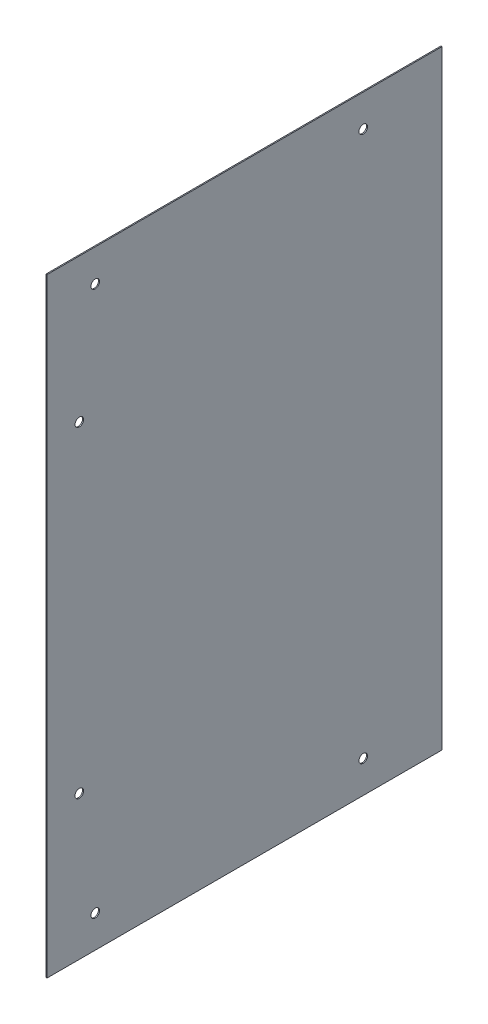
ISO-10303-21;
HEADER;
FILE_DESCRIPTION(('STEP AP214'),'2;1');
FILE_NAME('part.step','',(''),(''),'','','');
FILE_SCHEMA(('AUTOMOTIVE_DESIGN { 1 0 10303 214 1 1 1 1 }'));
ENDSEC;
DATA;
#1=APPLICATION_CONTEXT('core data for automotive mechanical design processes');
#2=APPLICATION_PROTOCOL_DEFINITION('international standard','automotive_design',2000,#1);
#3=PRODUCT_CONTEXT('',#1,'mechanical');
#4=PRODUCT('Part','Part','',(#3));
#5=PRODUCT_RELATED_PRODUCT_CATEGORY('part','',(#4));
#6=PRODUCT_DEFINITION_FORMATION('','',#4);
#7=PRODUCT_DEFINITION_CONTEXT('part definition',#1,'design');
#8=PRODUCT_DEFINITION('design','',#6,#7);
#9=PRODUCT_DEFINITION_SHAPE('','',#8);
#10=(LENGTH_UNIT() NAMED_UNIT(*) SI_UNIT(.MILLI.,.METRE.));
#11=(NAMED_UNIT(*) PLANE_ANGLE_UNIT() SI_UNIT($,.RADIAN.));
#12=(NAMED_UNIT(*) SI_UNIT($,.STERADIAN.) SOLID_ANGLE_UNIT());
#13=UNCERTAINTY_MEASURE_WITH_UNIT(LENGTH_MEASURE(1.E-05),#10,'distance_accuracy_value','');
#14=(GEOMETRIC_REPRESENTATION_CONTEXT(3) GLOBAL_UNCERTAINTY_ASSIGNED_CONTEXT((#13)) GLOBAL_UNIT_ASSIGNED_CONTEXT((#10,
#11,#12)) REPRESENTATION_CONTEXT('',''));
#15=CARTESIAN_POINT('',(0.,0.,0.));
#16=DIRECTION('',(0.,0.,1.));
#17=DIRECTION('',(1.,0.,0.));
#18=AXIS2_PLACEMENT_3D('',#15,#16,#17);
#19=CARTESIAN_POINT('',(0.5,0.,0.));
#20=DIRECTION('',(-1.,0.,0.));
#21=DIRECTION('',(0.,0.,1.));
#22=AXIS2_PLACEMENT_3D('',#19,#20,#21);
#23=PLANE('',#22);
#24=CARTESIAN_POINT('',(0.5,-254.125,139.261087025044));
#25=DIRECTION('',(-1.,0.,0.));
#26=DIRECTION('',(0.,0.,1.));
#27=AXIS2_PLACEMENT_3D('',#24,#25,#26);
#28=CIRCLE('',#27,3.99999999999999);
#29=CARTESIAN_POINT('',(0.5,-254.125,143.261087025044));
#30=VERTEX_POINT('',#29);
#31=EDGE_CURVE('E106',#30,#30,#28,.T.);
#32=ORIENTED_EDGE('',*,*,#31,.T.);
#33=EDGE_LOOP('',(#32));
#34=FACE_BOUND('',#33,.T.);
#35=CARTESIAN_POINT('',(0.5,150.,154.125));
#36=DIRECTION('',(-1.,0.,0.));
#37=DIRECTION('',(0.,0.,1.));
#38=AXIS2_PLACEMENT_3D('',#35,#36,#37);
#39=CIRCLE('',#38,3.99999999999999);
#40=CARTESIAN_POINT('',(0.5,150.,158.125));
#41=VERTEX_POINT('',#40);
#42=EDGE_CURVE('E126',#41,#41,#39,.T.);
#43=ORIENTED_EDGE('',*,*,#42,.T.);
#44=EDGE_LOOP('',(#43));
#45=FACE_BOUND('',#44,.T.);
#46=CARTESIAN_POINT('',(0.5,-254.125,-110.738912974956));
#47=DIRECTION('',(-1.,0.,0.));
#48=DIRECTION('',(0.,0.,1.));
#49=AXIS2_PLACEMENT_3D('',#46,#47,#48);
#50=CIRCLE('',#49,4.00000000000001);
#51=CARTESIAN_POINT('',(0.5,-254.125,-106.738912974956));
#52=VERTEX_POINT('',#51);
#53=EDGE_CURVE('E129',#52,#52,#50,.T.);
#54=ORIENTED_EDGE('',*,*,#53,.T.);
#55=EDGE_LOOP('',(#54));
#56=FACE_BOUND('',#55,.T.);
#57=CARTESIAN_POINT('',(0.5,-150.,154.125));
#58=DIRECTION('',(-1.,0.,0.));
#59=DIRECTION('',(0.,0.,1.));
#60=AXIS2_PLACEMENT_3D('',#57,#58,#59);
#61=CIRCLE('',#60,3.99999999999999);
#62=CARTESIAN_POINT('',(0.5,-150.,158.125));
#63=VERTEX_POINT('',#62);
#64=EDGE_CURVE('E132',#63,#63,#61,.T.);
#65=ORIENTED_EDGE('',*,*,#64,.T.);
#66=EDGE_LOOP('',(#65));
#67=FACE_BOUND('',#66,.T.);
#68=DIRECTION('',(0.,0.,-1.));
#69=VECTOR('',#68,1.);
#70=CARTESIAN_POINT('',(0.5,-284.125,-184.125));
#71=LINE('',#70,#69);
#72=CARTESIAN_POINT('',(0.5,-284.125,184.125));
#73=VERTEX_POINT('',#72);
#74=CARTESIAN_POINT('',(0.5,-284.125,-184.125));
#75=VERTEX_POINT('',#74);
#76=EDGE_CURVE('E91',#73,#75,#71,.T.);
#77=ORIENTED_EDGE('',*,*,#76,.T.);
#78=DIRECTION('',(0.,1.,0.));
#79=VECTOR('',#78,1.);
#80=CARTESIAN_POINT('',(0.5,-284.125,-184.125));
#81=LINE('',#80,#79);
#82=CARTESIAN_POINT('',(0.5,284.125,-184.125));
#83=VERTEX_POINT('',#82);
#84=EDGE_CURVE('E86',#75,#83,#81,.T.);
#85=ORIENTED_EDGE('',*,*,#84,.T.);
#86=DIRECTION('',(0.,0.,1.));
#87=VECTOR('',#86,1.);
#88=CARTESIAN_POINT('',(0.5,284.125,-184.125));
#89=LINE('',#88,#87);
#90=CARTESIAN_POINT('',(0.5,284.125,184.125));
#91=VERTEX_POINT('',#90);
#92=EDGE_CURVE('E89',#83,#91,#89,.T.);
#93=ORIENTED_EDGE('',*,*,#92,.T.);
#94=DIRECTION('',(0.,-1.,0.));
#95=VECTOR('',#94,1.);
#96=CARTESIAN_POINT('',(0.5,-284.125,184.125));
#97=LINE('',#96,#95);
#98=EDGE_CURVE('E56',#91,#73,#97,.T.);
#99=ORIENTED_EDGE('',*,*,#98,.T.);
#100=EDGE_LOOP('',(#77,#85,#93,#99));
#101=FACE_BOUND('',#100,.T.);
#102=CARTESIAN_POINT('',(0.5,254.125,139.261087025044));
#103=DIRECTION('',(-1.,0.,0.));
#104=DIRECTION('',(0.,0.,1.));
#105=AXIS2_PLACEMENT_3D('',#102,#103,#104);
#106=CIRCLE('',#105,3.99999999999999);
#107=CARTESIAN_POINT('',(0.5,254.125,143.261087025044));
#108=VERTEX_POINT('',#107);
#109=EDGE_CURVE('E123',#108,#108,#106,.F.);
#110=ORIENTED_EDGE('',*,*,#109,.F.);
#111=EDGE_LOOP('',(#110));
#112=FACE_BOUND('',#111,.T.);
#113=CARTESIAN_POINT('',(0.5,254.125,-110.738912974956));
#114=DIRECTION('',(-1.,0.,0.));
#115=DIRECTION('',(0.,0.,1.));
#116=AXIS2_PLACEMENT_3D('',#113,#114,#115);
#117=CIRCLE('',#116,4.00000000000001);
#118=CARTESIAN_POINT('',(0.5,254.125,-106.738912974956));
#119=VERTEX_POINT('',#118);
#120=EDGE_CURVE('E120',#119,#119,#117,.F.);
#121=ORIENTED_EDGE('',*,*,#120,.F.);
#122=EDGE_LOOP('',(#121));
#123=FACE_BOUND('',#122,.T.);
#124=ADVANCED_FACE('F39',(#34,#45,#56,#67,#101,#112,#123),#23,.F.);
#125=CARTESIAN_POINT('',(-0.5,0.,0.));
#126=DIRECTION('',(-1.,0.,0.));
#127=DIRECTION('',(0.,0.,1.));
#128=AXIS2_PLACEMENT_3D('',#125,#126,#127);
#129=PLANE('',#128);
#130=CARTESIAN_POINT('',(-0.5,-254.125,139.261087025044));
#131=DIRECTION('',(1.,0.,0.));
#132=DIRECTION('',(0.,0.,-1.));
#133=AXIS2_PLACEMENT_3D('',#130,#131,#132);
#134=CIRCLE('',#133,3.99999999999999);
#135=CARTESIAN_POINT('',(-0.5,-254.125,135.261087025044));
#136=VERTEX_POINT('',#135);
#137=EDGE_CURVE('E145',#136,#136,#134,.T.);
#138=ORIENTED_EDGE('',*,*,#137,.T.);
#139=EDGE_LOOP('',(#138));
#140=FACE_BOUND('',#139,.T.);
#141=CARTESIAN_POINT('',(-0.5,254.125,139.261087025044));
#142=DIRECTION('',(-1.,0.,0.));
#143=DIRECTION('',(0.,0.,1.));
#144=AXIS2_PLACEMENT_3D('',#141,#142,#143);
#145=CIRCLE('',#144,3.99999999999999);
#146=CARTESIAN_POINT('',(-0.5,254.125,143.261087025044));
#147=VERTEX_POINT('',#146);
#148=EDGE_CURVE('E139',#147,#147,#145,.T.);
#149=ORIENTED_EDGE('',*,*,#148,.F.);
#150=EDGE_LOOP('',(#149));
#151=FACE_BOUND('',#150,.T.);
#152=CARTESIAN_POINT('',(-0.5,150.,154.125));
#153=DIRECTION('',(1.,0.,0.));
#154=DIRECTION('',(0.,0.,-1.));
#155=AXIS2_PLACEMENT_3D('',#152,#153,#154);
#156=CIRCLE('',#155,3.99999999999999);
#157=CARTESIAN_POINT('',(-0.5,150.,150.125));
#158=VERTEX_POINT('',#157);
#159=EDGE_CURVE('E138',#158,#158,#156,.T.);
#160=ORIENTED_EDGE('',*,*,#159,.T.);
#161=EDGE_LOOP('',(#160));
#162=FACE_BOUND('',#161,.T.);
#163=CARTESIAN_POINT('',(-0.5,-254.125,-110.738912974956));
#164=DIRECTION('',(1.,0.,0.));
#165=DIRECTION('',(0.,0.,-1.));
#166=AXIS2_PLACEMENT_3D('',#163,#164,#165);
#167=CIRCLE('',#166,4.00000000000001);
#168=CARTESIAN_POINT('',(-0.5,-254.125,-114.738912974956));
#169=VERTEX_POINT('',#168);
#170=EDGE_CURVE('E148',#169,#169,#167,.T.);
#171=ORIENTED_EDGE('',*,*,#170,.T.);
#172=EDGE_LOOP('',(#171));
#173=FACE_BOUND('',#172,.T.);
#174=CARTESIAN_POINT('',(-0.5,-150.,154.125));
#175=DIRECTION('',(1.,0.,0.));
#176=DIRECTION('',(0.,0.,-1.));
#177=AXIS2_PLACEMENT_3D('',#174,#175,#176);
#178=CIRCLE('',#177,3.99999999999999);
#179=CARTESIAN_POINT('',(-0.5,-150.,150.125));
#180=VERTEX_POINT('',#179);
#181=EDGE_CURVE('E135',#180,#180,#178,.T.);
#182=ORIENTED_EDGE('',*,*,#181,.T.);
#183=EDGE_LOOP('',(#182));
#184=FACE_BOUND('',#183,.T.);
#185=DIRECTION('',(0.,0.,-1.));
#186=VECTOR('',#185,1.);
#187=CARTESIAN_POINT('',(-0.5,-284.125,-184.125));
#188=LINE('',#187,#186);
#189=CARTESIAN_POINT('',(-0.5,-284.125,184.125));
#190=VERTEX_POINT('',#189);
#191=CARTESIAN_POINT('',(-0.5,-284.125,-184.125));
#192=VERTEX_POINT('',#191);
#193=EDGE_CURVE('E103',#190,#192,#188,.T.);
#194=ORIENTED_EDGE('',*,*,#193,.F.);
#195=DIRECTION('',(0.,-1.,0.));
#196=VECTOR('',#195,1.);
#197=CARTESIAN_POINT('',(-0.5,-284.125,184.125));
#198=LINE('',#197,#196);
#199=CARTESIAN_POINT('',(-0.5,284.125,184.125));
#200=VERTEX_POINT('',#199);
#201=EDGE_CURVE('E79',#200,#190,#198,.T.);
#202=ORIENTED_EDGE('',*,*,#201,.F.);
#203=DIRECTION('',(0.,0.,1.));
#204=VECTOR('',#203,1.);
#205=CARTESIAN_POINT('',(-0.5,284.125,-184.125));
#206=LINE('',#205,#204);
#207=CARTESIAN_POINT('',(-0.5,284.125,-184.125));
#208=VERTEX_POINT('',#207);
#209=EDGE_CURVE('E73',#208,#200,#206,.T.);
#210=ORIENTED_EDGE('',*,*,#209,.F.);
#211=DIRECTION('',(0.,1.,0.));
#212=VECTOR('',#211,1.);
#213=CARTESIAN_POINT('',(-0.5,-284.125,-184.125));
#214=LINE('',#213,#212);
#215=EDGE_CURVE('E95',#192,#208,#214,.T.);
#216=ORIENTED_EDGE('',*,*,#215,.F.);
#217=EDGE_LOOP('',(#194,#202,#210,#216));
#218=FACE_BOUND('',#217,.T.);
#219=CARTESIAN_POINT('',(-0.5,254.125,-110.738912974956));
#220=DIRECTION('',(-1.,0.,0.));
#221=DIRECTION('',(0.,0.,1.));
#222=AXIS2_PLACEMENT_3D('',#219,#220,#221);
#223=CIRCLE('',#222,4.00000000000001);
#224=CARTESIAN_POINT('',(-0.5,254.125,-106.738912974956));
#225=VERTEX_POINT('',#224);
#226=EDGE_CURVE('E142',#225,#225,#223,.T.);
#227=ORIENTED_EDGE('',*,*,#226,.F.);
#228=EDGE_LOOP('',(#227));
#229=FACE_BOUND('',#228,.T.);
#230=ADVANCED_FACE('F114',(#140,#151,#162,#173,#184,#218,#229),#129,.T.);
#231=CARTESIAN_POINT('',(0.5,-284.125,-184.125));
#232=DIRECTION('',(0.,1.,0.));
#233=DIRECTION('',(0.,0.,1.));
#234=AXIS2_PLACEMENT_3D('',#231,#232,#233);
#235=PLANE('',#234);
#236=ORIENTED_EDGE('',*,*,#193,.T.);
#237=DIRECTION('',(-1.,0.,0.));
#238=VECTOR('',#237,1.);
#239=CARTESIAN_POINT('',(0.5,-284.125,-184.125));
#240=LINE('',#239,#238);
#241=EDGE_CURVE('E11',#75,#192,#240,.T.);
#242=ORIENTED_EDGE('',*,*,#241,.F.);
#243=ORIENTED_EDGE('',*,*,#76,.F.);
#244=DIRECTION('',(-1.,0.,0.));
#245=VECTOR('',#244,1.);
#246=CARTESIAN_POINT('',(0.5,-284.125,184.125));
#247=LINE('',#246,#245);
#248=EDGE_CURVE('E99',#73,#190,#247,.T.);
#249=ORIENTED_EDGE('',*,*,#248,.T.);
#250=EDGE_LOOP('',(#236,#242,#243,#249));
#251=FACE_BOUND('',#250,.T.);
#252=ADVANCED_FACE('F41',(#251),#235,.F.);
#253=CARTESIAN_POINT('',(0.5,-284.125,-184.125));
#254=DIRECTION('',(0.,0.,1.));
#255=DIRECTION('',(1.,0.,0.));
#256=AXIS2_PLACEMENT_3D('',#253,#254,#255);
#257=PLANE('',#256);
#258=ORIENTED_EDGE('',*,*,#215,.T.);
#259=DIRECTION('',(-1.,0.,0.));
#260=VECTOR('',#259,1.);
#261=CARTESIAN_POINT('',(0.5,284.125,-184.125));
#262=LINE('',#261,#260);
#263=EDGE_CURVE('E48',#83,#208,#262,.T.);
#264=ORIENTED_EDGE('',*,*,#263,.F.);
#265=ORIENTED_EDGE('',*,*,#84,.F.);
#266=ORIENTED_EDGE('',*,*,#241,.T.);
#267=EDGE_LOOP('',(#258,#264,#265,#266));
#268=FACE_BOUND('',#267,.T.);
#269=ADVANCED_FACE('F94',(#268),#257,.F.);
#270=CARTESIAN_POINT('',(0.5,284.125,-184.125));
#271=DIRECTION('',(0.,-1.,0.));
#272=DIRECTION('',(0.,0.,-1.));
#273=AXIS2_PLACEMENT_3D('',#270,#271,#272);
#274=PLANE('',#273);
#275=ORIENTED_EDGE('',*,*,#209,.T.);
#276=DIRECTION('',(-1.,0.,0.));
#277=VECTOR('',#276,1.);
#278=CARTESIAN_POINT('',(0.5,284.125,184.125));
#279=LINE('',#278,#277);
#280=EDGE_CURVE('E96',#91,#200,#279,.T.);
#281=ORIENTED_EDGE('',*,*,#280,.F.);
#282=ORIENTED_EDGE('',*,*,#92,.F.);
#283=ORIENTED_EDGE('',*,*,#263,.T.);
#284=EDGE_LOOP('',(#275,#281,#282,#283));
#285=FACE_BOUND('',#284,.T.);
#286=ADVANCED_FACE('F97',(#285),#274,.F.);
#287=CARTESIAN_POINT('',(0.5,-284.125,184.125));
#288=DIRECTION('',(0.,0.,-1.));
#289=DIRECTION('',(0.,1.,0.));
#290=AXIS2_PLACEMENT_3D('',#287,#288,#289);
#291=PLANE('',#290);
#292=ORIENTED_EDGE('',*,*,#201,.T.);
#293=ORIENTED_EDGE('',*,*,#248,.F.);
#294=ORIENTED_EDGE('',*,*,#98,.F.);
#295=ORIENTED_EDGE('',*,*,#280,.T.);
#296=EDGE_LOOP('',(#292,#293,#294,#295));
#297=FACE_BOUND('',#296,.T.);
#298=ADVANCED_FACE('F111',(#297),#291,.F.);
#299=CARTESIAN_POINT('',(-0.5,-150.,154.125));
#300=DIRECTION('',(1.,0.,0.));
#301=DIRECTION('',(0.,0.,-1.));
#302=AXIS2_PLACEMENT_3D('',#299,#300,#301);
#303=CYLINDRICAL_SURFACE('',#302,3.99999999999999);
#304=ORIENTED_EDGE('',*,*,#181,.F.);
#305=EDGE_LOOP('',(#304));
#306=FACE_BOUND('',#305,.T.);
#307=ORIENTED_EDGE('',*,*,#64,.F.);
#308=EDGE_LOOP('',(#307));
#309=FACE_BOUND('',#308,.T.);
#310=ADVANCED_FACE('F160',(#306,#309),#303,.F.);
#311=CARTESIAN_POINT('',(-0.5,-254.125,-110.738912974956));
#312=DIRECTION('',(1.,0.,0.));
#313=DIRECTION('',(0.,0.,-1.));
#314=AXIS2_PLACEMENT_3D('',#311,#312,#313);
#315=CYLINDRICAL_SURFACE('',#314,4.00000000000001);
#316=ORIENTED_EDGE('',*,*,#170,.F.);
#317=EDGE_LOOP('',(#316));
#318=FACE_BOUND('',#317,.T.);
#319=ORIENTED_EDGE('',*,*,#53,.F.);
#320=EDGE_LOOP('',(#319));
#321=FACE_BOUND('',#320,.T.);
#322=ADVANCED_FACE('F156',(#318,#321),#315,.F.);
#323=CARTESIAN_POINT('',(-0.5,150.,154.125));
#324=DIRECTION('',(1.,0.,0.));
#325=DIRECTION('',(0.,0.,-1.));
#326=AXIS2_PLACEMENT_3D('',#323,#324,#325);
#327=CYLINDRICAL_SURFACE('',#326,3.99999999999999);
#328=ORIENTED_EDGE('',*,*,#159,.F.);
#329=EDGE_LOOP('',(#328));
#330=FACE_BOUND('',#329,.T.);
#331=ORIENTED_EDGE('',*,*,#42,.F.);
#332=EDGE_LOOP('',(#331));
#333=FACE_BOUND('',#332,.T.);
#334=ADVANCED_FACE('F159',(#330,#333),#327,.F.);
#335=CARTESIAN_POINT('',(-0.5,254.125,139.261087025044));
#336=DIRECTION('',(1.,0.,0.));
#337=DIRECTION('',(0.,0.,-1.));
#338=AXIS2_PLACEMENT_3D('',#335,#336,#337);
#339=CYLINDRICAL_SURFACE('',#338,3.99999999999999);
#340=ORIENTED_EDGE('',*,*,#148,.T.);
#341=EDGE_LOOP('',(#340));
#342=FACE_BOUND('',#341,.T.);
#343=ORIENTED_EDGE('',*,*,#109,.T.);
#344=EDGE_LOOP('',(#343));
#345=FACE_BOUND('',#344,.T.);
#346=ADVANCED_FACE('F180',(#342,#345),#339,.F.);
#347=CARTESIAN_POINT('',(-0.5,254.125,-110.738912974956));
#348=DIRECTION('',(1.,0.,0.));
#349=DIRECTION('',(0.,0.,-1.));
#350=AXIS2_PLACEMENT_3D('',#347,#348,#349);
#351=CYLINDRICAL_SURFACE('',#350,4.00000000000001);
#352=ORIENTED_EDGE('',*,*,#226,.T.);
#353=EDGE_LOOP('',(#352));
#354=FACE_BOUND('',#353,.T.);
#355=ORIENTED_EDGE('',*,*,#120,.T.);
#356=EDGE_LOOP('',(#355));
#357=FACE_BOUND('',#356,.T.);
#358=ADVANCED_FACE('F248',(#354,#357),#351,.F.);
#359=CARTESIAN_POINT('',(-0.5,-254.125,139.261087025044));
#360=DIRECTION('',(1.,0.,0.));
#361=DIRECTION('',(0.,0.,-1.));
#362=AXIS2_PLACEMENT_3D('',#359,#360,#361);
#363=CYLINDRICAL_SURFACE('',#362,3.99999999999999);
#364=ORIENTED_EDGE('',*,*,#137,.F.);
#365=EDGE_LOOP('',(#364));
#366=FACE_BOUND('',#365,.T.);
#367=ORIENTED_EDGE('',*,*,#31,.F.);
#368=EDGE_LOOP('',(#367));
#369=FACE_BOUND('',#368,.T.);
#370=ADVANCED_FACE('F257',(#366,#369),#363,.F.);
#371=CLOSED_SHELL('',(#124,#230,#252,#269,#286,#298,#310,#322,#334,#346,#358,#370));
#372=MANIFOLD_SOLID_BREP('B2',#371);
#373=ADVANCED_BREP_SHAPE_REPRESENTATION('',(#18,#372),#14);
#374=SHAPE_DEFINITION_REPRESENTATION(#9,#373);
ENDSEC;
END-ISO-10303-21;
